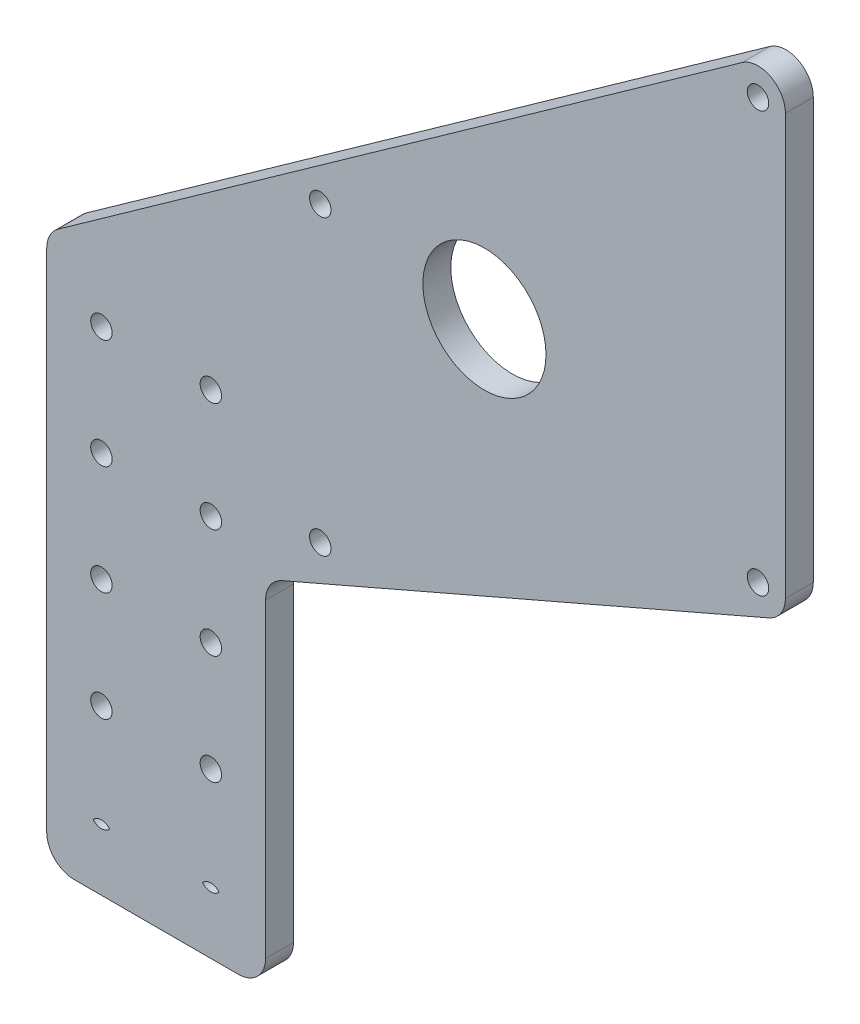
ISO-10303-21;
HEADER;
FILE_DESCRIPTION(('STEP AP214'),'2;1');
FILE_NAME('part.step','',(''),(''),'','','');
FILE_SCHEMA(('AUTOMOTIVE_DESIGN { 1 0 10303 214 1 1 1 1 }'));
ENDSEC;
DATA;
#1=APPLICATION_CONTEXT('core data for automotive mechanical design processes');
#2=APPLICATION_PROTOCOL_DEFINITION('international standard','automotive_design',2000,#1);
#3=PRODUCT_CONTEXT('',#1,'mechanical');
#4=PRODUCT('Part','Part','',(#3));
#5=PRODUCT_RELATED_PRODUCT_CATEGORY('part','',(#4));
#6=PRODUCT_DEFINITION_FORMATION('','',#4);
#7=PRODUCT_DEFINITION_CONTEXT('part definition',#1,'design');
#8=PRODUCT_DEFINITION('design','',#6,#7);
#9=PRODUCT_DEFINITION_SHAPE('','',#8);
#10=(LENGTH_UNIT() NAMED_UNIT(*) SI_UNIT(.MILLI.,.METRE.));
#11=(NAMED_UNIT(*) PLANE_ANGLE_UNIT() SI_UNIT($,.RADIAN.));
#12=(NAMED_UNIT(*) SI_UNIT($,.STERADIAN.) SOLID_ANGLE_UNIT());
#13=UNCERTAINTY_MEASURE_WITH_UNIT(LENGTH_MEASURE(1.E-05),#10,'distance_accuracy_value','');
#14=(GEOMETRIC_REPRESENTATION_CONTEXT(3) GLOBAL_UNCERTAINTY_ASSIGNED_CONTEXT((#13)) GLOBAL_UNIT_ASSIGNED_CONTEXT((#10,
#11,#12)) REPRESENTATION_CONTEXT('',''));
#15=CARTESIAN_POINT('',(0.,0.,0.));
#16=DIRECTION('',(0.,0.,1.));
#17=DIRECTION('',(1.,0.,0.));
#18=AXIS2_PLACEMENT_3D('',#15,#16,#17);
#19=CARTESIAN_POINT('',(482.6,0.,6.477));
#20=DIRECTION('',(1.,0.,0.));
#21=DIRECTION('',(0.,0.,-1.));
#22=AXIS2_PLACEMENT_3D('',#19,#20,#21);
#23=PLANE('',#22);
#24=DIRECTION('',(0.,-1.,0.));
#25=VECTOR('',#24,1.);
#26=CARTESIAN_POINT('',(482.6,0.,6.477));
#27=LINE('',#26,#25);
#28=CARTESIAN_POINT('',(482.6,573.049213564164,6.477));
#29=VERTEX_POINT('',#28);
#30=CARTESIAN_POINT('',(482.6,455.676,6.477));
#31=VERTEX_POINT('',#30);
#32=EDGE_CURVE('E219',#29,#31,#27,.T.);
#33=ORIENTED_EDGE('',*,*,#32,.F.);
#34=DIRECTION('',(0.,0.,-1.));
#35=VECTOR('',#34,1.);
#36=CARTESIAN_POINT('',(482.6,573.049213564164,0.));
#37=LINE('',#36,#35);
#38=CARTESIAN_POINT('',(482.6,573.049213564164,0.));
#39=VERTEX_POINT('',#38);
#40=EDGE_CURVE('E289',#29,#39,#37,.T.);
#41=ORIENTED_EDGE('',*,*,#40,.T.);
#42=DIRECTION('',(0.,-1.,0.));
#43=VECTOR('',#42,1.);
#44=CARTESIAN_POINT('',(482.6,0.,0.));
#45=LINE('',#44,#43);
#46=CARTESIAN_POINT('',(482.6,455.676,0.));
#47=VERTEX_POINT('',#46);
#48=EDGE_CURVE('E218',#39,#47,#45,.T.);
#49=ORIENTED_EDGE('',*,*,#48,.T.);
#50=DIRECTION('',(0.,0.,-1.));
#51=VECTOR('',#50,1.);
#52=CARTESIAN_POINT('',(482.6,455.676,6.477));
#53=LINE('',#52,#51);
#54=EDGE_CURVE('E287',#47,#31,#53,.F.);
#55=ORIENTED_EDGE('',*,*,#54,.T.);
#56=EDGE_LOOP('',(#33,#41,#49,#55));
#57=FACE_BOUND('',#56,.T.);
#58=ADVANCED_FACE('F43',(#57),#23,.F.);
#59=CARTESIAN_POINT('',(0.,449.326,6.477));
#60=DIRECTION('',(0.,1.,0.));
#61=DIRECTION('',(0.,0.,1.));
#62=AXIS2_PLACEMENT_3D('',#59,#60,#61);
#63=PLANE('',#62);
#64=DIRECTION('',(1.,0.,0.));
#65=VECTOR('',#64,1.);
#66=CARTESIAN_POINT('',(0.,449.326,6.477));
#67=LINE('',#66,#65);
#68=CARTESIAN_POINT('',(488.95,449.326,6.477));
#69=VERTEX_POINT('',#68);
#70=CARTESIAN_POINT('',(527.05,449.326,6.477));
#71=VERTEX_POINT('',#70);
#72=EDGE_CURVE('E222',#69,#71,#67,.T.);
#73=ORIENTED_EDGE('',*,*,#72,.F.);
#74=DIRECTION('',(0.,0.,-1.));
#75=VECTOR('',#74,1.);
#76=CARTESIAN_POINT('',(488.95,449.326,6.477));
#77=LINE('',#76,#75);
#78=CARTESIAN_POINT('',(488.95,449.326,0.));
#79=VERTEX_POINT('',#78);
#80=EDGE_CURVE('E298',#69,#79,#77,.T.);
#81=ORIENTED_EDGE('',*,*,#80,.T.);
#82=DIRECTION('',(1.,0.,0.));
#83=VECTOR('',#82,1.);
#84=CARTESIAN_POINT('',(0.,449.326,0.));
#85=LINE('',#84,#83);
#86=CARTESIAN_POINT('',(527.05,449.326,0.));
#87=VERTEX_POINT('',#86);
#88=EDGE_CURVE('E240',#79,#87,#85,.T.);
#89=ORIENTED_EDGE('',*,*,#88,.T.);
#90=DIRECTION('',(0.,0.,-1.));
#91=VECTOR('',#90,1.);
#92=CARTESIAN_POINT('',(527.05,449.326,6.477));
#93=LINE('',#92,#91);
#94=EDGE_CURVE('E296',#87,#71,#93,.F.);
#95=ORIENTED_EDGE('',*,*,#94,.T.);
#96=EDGE_LOOP('',(#73,#81,#89,#95));
#97=FACE_BOUND('',#96,.T.);
#98=ADVANCED_FACE('F344',(#97),#63,.F.);
#99=CARTESIAN_POINT('',(533.4,0.,6.477));
#100=DIRECTION('',(1.,0.,0.));
#101=DIRECTION('',(0.,0.,-1.));
#102=AXIS2_PLACEMENT_3D('',#99,#100,#101);
#103=PLANE('',#102);
#104=DIRECTION('',(0.,-1.,0.));
#105=VECTOR('',#104,1.);
#106=CARTESIAN_POINT('',(533.4,0.,0.));
#107=LINE('',#106,#105);
#108=CARTESIAN_POINT('',(533.4,527.708447184373,0.));
#109=VERTEX_POINT('',#108);
#110=CARTESIAN_POINT('',(533.4,455.676,0.));
#111=VERTEX_POINT('',#110);
#112=EDGE_CURVE('E243',#109,#111,#107,.T.);
#113=ORIENTED_EDGE('',*,*,#112,.F.);
#114=DIRECTION('',(0.,0.,-1.));
#115=VECTOR('',#114,1.);
#116=CARTESIAN_POINT('',(533.4,527.708447184373,6.477));
#117=LINE('',#116,#115);
#118=CARTESIAN_POINT('',(533.4,527.708447184373,6.477));
#119=VERTEX_POINT('',#118);
#120=EDGE_CURVE('E285',#109,#119,#117,.F.);
#121=ORIENTED_EDGE('',*,*,#120,.T.);
#122=DIRECTION('',(0.,-1.,0.));
#123=VECTOR('',#122,1.);
#124=CARTESIAN_POINT('',(533.4,0.,6.477));
#125=LINE('',#124,#123);
#126=CARTESIAN_POINT('',(533.4,455.676,6.477));
#127=VERTEX_POINT('',#126);
#128=EDGE_CURVE('E226',#119,#127,#125,.T.);
#129=ORIENTED_EDGE('',*,*,#128,.T.);
#130=DIRECTION('',(0.,0.,-1.));
#131=VECTOR('',#130,1.);
#132=CARTESIAN_POINT('',(533.4,455.676,0.));
#133=LINE('',#132,#131);
#134=EDGE_CURVE('E282',#127,#111,#133,.T.);
#135=ORIENTED_EDGE('',*,*,#134,.T.);
#136=EDGE_LOOP('',(#113,#121,#129,#135));
#137=FACE_BOUND('',#136,.T.);
#138=ADVANCED_FACE('F307',(#137),#103,.T.);
#139=CARTESIAN_POINT('',(-109.708999817194,252.969781131557,6.477));
#140=DIRECTION('',(-0.397878437417604,0.917438144529715,0.));
#141=DIRECTION('',(-0.917438144529715,-0.397878437417604,0.));
#142=AXIS2_PLACEMENT_3D('',#139,#140,#141);
#143=PLANE('',#142);
#144=DIRECTION('',(0.917438144529715,0.397878437417604,0.));
#145=VECTOR('',#144,1.);
#146=CARTESIAN_POINT('',(-109.708999817194,252.969781131557,0.));
#147=LINE('',#146,#145);
#148=CARTESIAN_POINT('',(537.223471922398,533.534179402137,0.));
#149=VERTEX_POINT('',#148);
#150=CARTESIAN_POINT('',(650.226528077602,582.54182059793,0.));
#151=VERTEX_POINT('',#150);
#152=EDGE_CURVE('E246',#149,#151,#147,.T.);
#153=ORIENTED_EDGE('',*,*,#152,.T.);
#154=DIRECTION('',(0.,0.,-1.));
#155=VECTOR('',#154,1.);
#156=CARTESIAN_POINT('',(650.226528077602,582.54182059793,6.477));
#157=LINE('',#156,#155);
#158=CARTESIAN_POINT('',(650.226528077602,582.54182059793,6.477));
#159=VERTEX_POINT('',#158);
#160=EDGE_CURVE('E271',#151,#159,#157,.F.);
#161=ORIENTED_EDGE('',*,*,#160,.T.);
#162=DIRECTION('',(0.917438144529715,0.397878437417604,0.));
#163=VECTOR('',#162,1.);
#164=CARTESIAN_POINT('',(-109.708999817194,252.969781131557,6.477));
#165=LINE('',#164,#163);
#166=CARTESIAN_POINT('',(537.223471922398,533.534179402137,6.477));
#167=VERTEX_POINT('',#166);
#168=EDGE_CURVE('E229',#167,#159,#165,.T.);
#169=ORIENTED_EDGE('',*,*,#168,.F.);
#170=DIRECTION('',(0.,0.,-1.));
#171=VECTOR('',#170,1.);
#172=CARTESIAN_POINT('',(537.223471922398,533.534179402137,6.477));
#173=LINE('',#172,#171);
#174=EDGE_CURVE('E268',#167,#149,#173,.T.);
#175=ORIENTED_EDGE('',*,*,#174,.T.);
#176=EDGE_LOOP('',(#153,#161,#169,#175));
#177=FACE_BOUND('',#176,.T.);
#178=ADVANCED_FACE('F316',(#177),#143,.F.);
#179=CARTESIAN_POINT('',(654.05,0.,6.477));
#180=DIRECTION('',(1.,0.,0.));
#181=DIRECTION('',(0.,0.,-1.));
#182=AXIS2_PLACEMENT_3D('',#179,#180,#181);
#183=PLANE('',#182);
#184=DIRECTION('',(0.,-1.,0.));
#185=VECTOR('',#184,1.);
#186=CARTESIAN_POINT('',(654.05,0.,6.477));
#187=LINE('',#186,#185);
#188=CARTESIAN_POINT('',(654.05,685.90815033516,6.477));
#189=VERTEX_POINT('',#188);
#190=CARTESIAN_POINT('',(654.05,588.367552815693,6.477));
#191=VERTEX_POINT('',#190);
#192=EDGE_CURVE('E232',#189,#191,#187,.T.);
#193=ORIENTED_EDGE('',*,*,#192,.T.);
#194=DIRECTION('',(0.,0.,-1.));
#195=VECTOR('',#194,1.);
#196=CARTESIAN_POINT('',(654.05,588.367552815693,0.));
#197=LINE('',#196,#195);
#198=CARTESIAN_POINT('',(654.05,588.367552815693,0.));
#199=VERTEX_POINT('',#198);
#200=EDGE_CURVE('E255',#191,#199,#197,.T.);
#201=ORIENTED_EDGE('',*,*,#200,.T.);
#202=DIRECTION('',(0.,-1.,0.));
#203=VECTOR('',#202,1.);
#204=CARTESIAN_POINT('',(654.05,0.,0.));
#205=LINE('',#204,#203);
#206=CARTESIAN_POINT('',(654.05,685.90815033516,0.));
#207=VERTEX_POINT('',#206);
#208=EDGE_CURVE('E249',#207,#199,#205,.T.);
#209=ORIENTED_EDGE('',*,*,#208,.F.);
#210=DIRECTION('',(0.,0.,-1.));
#211=VECTOR('',#210,1.);
#212=CARTESIAN_POINT('',(654.05,685.90815033516,6.477));
#213=LINE('',#212,#211);
#214=EDGE_CURVE('E237',#207,#189,#213,.F.);
#215=ORIENTED_EDGE('',*,*,#214,.T.);
#216=EDGE_LOOP('',(#193,#201,#209,#215));
#217=FACE_BOUND('',#216,.T.);
#218=ADVANCED_FACE('F322',(#217),#183,.T.);
#219=CARTESIAN_POINT('',(-110.143945438851,154.931030175283,6.477));
#220=DIRECTION('',(-0.579421651674522,0.815027944042883,0.));
#221=DIRECTION('',(-0.815027944042883,-0.579421651674522,0.));
#222=AXIS2_PLACEMENT_3D('',#219,#220,#221);
#223=PLANE('',#222);
#224=DIRECTION('',(0.815027944042883,0.579421651674522,0.));
#225=VECTOR('',#224,1.);
#226=CARTESIAN_POINT('',(-110.143945438851,154.931030175283,0.));
#227=LINE('',#226,#225);
#228=CARTESIAN_POINT('',(485.270672511867,578.224641008837,0.));
#229=VERTEX_POINT('',#228);
#230=CARTESIAN_POINT('',(644.020672511867,691.083577779833,0.));
#231=VERTEX_POINT('',#230);
#232=EDGE_CURVE('E223',#229,#231,#227,.T.);
#233=ORIENTED_EDGE('',*,*,#232,.F.);
#234=DIRECTION('',(0.,0.,-1.));
#235=VECTOR('',#234,1.);
#236=CARTESIAN_POINT('',(485.270672511867,578.224641008837,6.477));
#237=LINE('',#236,#235);
#238=CARTESIAN_POINT('',(485.270672511867,578.224641008837,6.477));
#239=VERTEX_POINT('',#238);
#240=EDGE_CURVE('E65',#229,#239,#237,.F.);
#241=ORIENTED_EDGE('',*,*,#240,.T.);
#242=DIRECTION('',(0.815027944042883,0.579421651674522,0.));
#243=VECTOR('',#242,1.);
#244=CARTESIAN_POINT('',(-110.143945438851,154.931030175283,6.477));
#245=LINE('',#244,#243);
#246=CARTESIAN_POINT('',(644.020672511867,691.083577779833,6.477));
#247=VERTEX_POINT('',#246);
#248=EDGE_CURVE('E235',#239,#247,#245,.T.);
#249=ORIENTED_EDGE('',*,*,#248,.T.);
#250=DIRECTION('',(0.,0.,-1.));
#251=VECTOR('',#250,1.);
#252=CARTESIAN_POINT('',(644.020672511867,691.083577779833,6.477));
#253=LINE('',#252,#251);
#254=EDGE_CURVE('E292',#247,#231,#253,.T.);
#255=ORIENTED_EDGE('',*,*,#254,.T.);
#256=EDGE_LOOP('',(#233,#241,#249,#255));
#257=FACE_BOUND('',#256,.T.);
#258=ADVANCED_FACE('F328',(#257),#223,.T.);
#259=CARTESIAN_POINT('',(0.,0.,6.477));
#260=DIRECTION('',(0.,0.,1.));
#261=DIRECTION('',(1.,0.,0.));
#262=AXIS2_PLACEMENT_3D('',#259,#260,#261);
#263=PLANE('',#262);
#264=CARTESIAN_POINT('',(546.1,545.637294927086,6.477));
#265=DIRECTION('',(0.,0.,1.));
#266=DIRECTION('',(1.,0.,0.));
#267=AXIS2_PLACEMENT_3D('',#264,#265,#266);
#268=CIRCLE('',#267,2.48919999999994);
#269=CARTESIAN_POINT('',(548.5892,545.637294927086,6.477));
#270=VERTEX_POINT('',#269);
#271=EDGE_CURVE('E612',#270,#270,#268,.T.);
#272=ORIENTED_EDGE('',*,*,#271,.F.);
#273=EDGE_LOOP('',(#272));
#274=FACE_BOUND('',#273,.T.);
#275=CARTESIAN_POINT('',(495.3,487.426,6.477));
#276=DIRECTION('',(0.,0.,1.));
#277=DIRECTION('',(1.,0.,0.));
#278=AXIS2_PLACEMENT_3D('',#275,#276,#277);
#279=CIRCLE('',#278,2.48920000000001);
#280=CARTESIAN_POINT('',(497.7892,487.426,6.477));
#281=VERTEX_POINT('',#280);
#282=EDGE_CURVE('E616',#281,#281,#279,.T.);
#283=ORIENTED_EDGE('',*,*,#282,.F.);
#284=EDGE_LOOP('',(#283));
#285=FACE_BOUND('',#284,.T.);
#286=CARTESIAN_POINT('',(520.7,487.426,6.477));
#287=DIRECTION('',(0.,0.,1.));
#288=DIRECTION('',(1.,0.,0.));
#289=AXIS2_PLACEMENT_3D('',#286,#287,#288);
#290=CIRCLE('',#289,2.48920000000006);
#291=CARTESIAN_POINT('',(523.1892,487.426,6.477));
#292=VERTEX_POINT('',#291);
#293=EDGE_CURVE('E620',#292,#292,#290,.T.);
#294=ORIENTED_EDGE('',*,*,#293,.F.);
#295=EDGE_LOOP('',(#294));
#296=FACE_BOUND('',#295,.T.);
#297=CARTESIAN_POINT('',(520.7,563.626,6.477));
#298=DIRECTION('',(0.,0.,1.));
#299=DIRECTION('',(1.,0.,0.));
#300=AXIS2_PLACEMENT_3D('',#297,#298,#299);
#301=CIRCLE('',#300,2.48920000000008);
#302=CARTESIAN_POINT('',(523.1892,563.626,6.477));
#303=VERTEX_POINT('',#302);
#304=EDGE_CURVE('E624',#303,#303,#301,.T.);
#305=ORIENTED_EDGE('',*,*,#304,.F.);
#306=EDGE_LOOP('',(#305));
#307=FACE_BOUND('',#306,.T.);
#308=CARTESIAN_POINT('',(647.7,588.416242295507,6.477));
#309=DIRECTION('',(0.,0.,1.));
#310=DIRECTION('',(1.,0.,0.));
#311=AXIS2_PLACEMENT_3D('',#308,#309,#310);
#312=CIRCLE('',#311,2.48919999999994);
#313=CARTESIAN_POINT('',(650.1892,588.416242295507,6.477));
#314=VERTEX_POINT('',#313);
#315=EDGE_CURVE('E201',#314,#314,#312,.T.);
#316=ORIENTED_EDGE('',*,*,#315,.F.);
#317=EDGE_LOOP('',(#316));
#318=FACE_BOUND('',#317,.T.);
#319=CARTESIAN_POINT('',(647.7,685.90815033516,6.477));
#320=DIRECTION('',(0.,0.,1.));
#321=DIRECTION('',(1.,0.,0.));
#322=AXIS2_PLACEMENT_3D('',#319,#320,#321);
#323=CIRCLE('',#322,2.48919999999994);
#324=CARTESIAN_POINT('',(650.1892,685.90815033516,6.477));
#325=VERTEX_POINT('',#324);
#326=EDGE_CURVE('E195',#325,#325,#323,.T.);
#327=ORIENTED_EDGE('',*,*,#326,.F.);
#328=EDGE_LOOP('',(#327));
#329=FACE_BOUND('',#328,.T.);
#330=CARTESIAN_POINT('',(584.20000000001,609.600000000067,6.477));
#331=DIRECTION('',(0.,0.,1.));
#332=DIRECTION('',(1.,0.,0.));
#333=AXIS2_PLACEMENT_3D('',#330,#331,#332);
#334=CIRCLE('',#333,14.2875000000112);
#335=CARTESIAN_POINT('',(598.487500000021,609.600000000067,6.477));
#336=VERTEX_POINT('',#335);
#337=EDGE_CURVE('E189',#336,#336,#334,.T.);
#338=ORIENTED_EDGE('',*,*,#337,.F.);
#339=EDGE_LOOP('',(#338));
#340=FACE_BOUND('',#339,.T.);
#341=CARTESIAN_POINT('',(520.7,462.026,6.477));
#342=DIRECTION('',(0.,0.,1.));
#343=DIRECTION('',(1.,0.,0.));
#344=AXIS2_PLACEMENT_3D('',#341,#342,#343);
#345=CIRCLE('',#344,2.48920000000006);
#346=CARTESIAN_POINT('',(522.61727942408,463.6135,6.477));
#347=VERTEX_POINT('',#346);
#348=CARTESIAN_POINT('',(518.78272057592,463.6135,6.477));
#349=VERTEX_POINT('',#348);
#350=EDGE_CURVE('E184',#347,#349,#345,.T.);
#351=ORIENTED_EDGE('',*,*,#350,.F.);
#352=CARTESIAN_POINT('',(520.7,465.201,6.477));
#353=DIRECTION('',(0.,0.,1.));
#354=DIRECTION('',(1.,0.,0.));
#355=AXIS2_PLACEMENT_3D('',#352,#353,#354);
#356=CIRCLE('',#355,2.48919999999995);
#357=EDGE_CURVE('E167',#349,#347,#356,.T.);
#358=ORIENTED_EDGE('',*,*,#357,.F.);
#359=EDGE_LOOP('',(#351,#358));
#360=FACE_BOUND('',#359,.T.);
#361=CARTESIAN_POINT('',(546.1,613.678430801723,6.477));
#362=DIRECTION('',(0.,0.,1.));
#363=DIRECTION('',(1.,0.,0.));
#364=AXIS2_PLACEMENT_3D('',#361,#362,#363);
#365=CIRCLE('',#364,2.48919999999994);
#366=CARTESIAN_POINT('',(548.5892,613.678430801723,6.477));
#367=VERTEX_POINT('',#366);
#368=EDGE_CURVE('E635',#367,#367,#365,.T.);
#369=ORIENTED_EDGE('',*,*,#368,.F.);
#370=EDGE_LOOP('',(#369));
#371=FACE_BOUND('',#370,.T.);
#372=CARTESIAN_POINT('',(520.7,512.826,6.477));
#373=DIRECTION('',(0.,0.,1.));
#374=DIRECTION('',(1.,0.,0.));
#375=AXIS2_PLACEMENT_3D('',#372,#373,#374);
#376=CIRCLE('',#375,2.48919999999994);
#377=CARTESIAN_POINT('',(523.1892,512.826,6.477));
#378=VERTEX_POINT('',#377);
#379=EDGE_CURVE('E639',#378,#378,#376,.T.);
#380=ORIENTED_EDGE('',*,*,#379,.F.);
#381=EDGE_LOOP('',(#380));
#382=FACE_BOUND('',#381,.T.);
#383=CARTESIAN_POINT('',(495.3,563.626,6.477));
#384=DIRECTION('',(0.,0.,1.));
#385=DIRECTION('',(1.,0.,0.));
#386=AXIS2_PLACEMENT_3D('',#383,#384,#385);
#387=CIRCLE('',#386,2.48919999999988);
#388=CARTESIAN_POINT('',(497.7892,563.626,6.477));
#389=VERTEX_POINT('',#388);
#390=EDGE_CURVE('E643',#389,#389,#387,.T.);
#391=ORIENTED_EDGE('',*,*,#390,.F.);
#392=EDGE_LOOP('',(#391));
#393=FACE_BOUND('',#392,.T.);
#394=CARTESIAN_POINT('',(495.3,538.226,6.477));
#395=DIRECTION('',(0.,0.,1.));
#396=DIRECTION('',(1.,0.,0.));
#397=AXIS2_PLACEMENT_3D('',#394,#395,#396);
#398=CIRCLE('',#397,2.48919999999988);
#399=CARTESIAN_POINT('',(497.7892,538.226,6.477));
#400=VERTEX_POINT('',#399);
#401=EDGE_CURVE('E647',#400,#400,#398,.T.);
#402=ORIENTED_EDGE('',*,*,#401,.F.);
#403=EDGE_LOOP('',(#402));
#404=FACE_BOUND('',#403,.T.);
#405=CARTESIAN_POINT('',(520.7,538.226,6.477));
#406=DIRECTION('',(0.,0.,1.));
#407=DIRECTION('',(1.,0.,0.));
#408=AXIS2_PLACEMENT_3D('',#405,#406,#407);
#409=CIRCLE('',#408,2.48919999999994);
#410=CARTESIAN_POINT('',(523.1892,538.226,6.477));
#411=VERTEX_POINT('',#410);
#412=EDGE_CURVE('E651',#411,#411,#409,.T.);
#413=ORIENTED_EDGE('',*,*,#412,.F.);
#414=EDGE_LOOP('',(#413));
#415=FACE_BOUND('',#414,.T.);
#416=CARTESIAN_POINT('',(495.3,512.826,6.477));
#417=DIRECTION('',(0.,0.,1.));
#418=DIRECTION('',(1.,0.,0.));
#419=AXIS2_PLACEMENT_3D('',#416,#417,#418);
#420=CIRCLE('',#419,2.48919999999994);
#421=CARTESIAN_POINT('',(497.7892,512.826,6.477));
#422=VERTEX_POINT('',#421);
#423=EDGE_CURVE('E655',#422,#422,#420,.T.);
#424=ORIENTED_EDGE('',*,*,#423,.F.);
#425=EDGE_LOOP('',(#424));
#426=FACE_BOUND('',#425,.T.);
#427=CARTESIAN_POINT('',(495.3,462.026,6.477));
#428=DIRECTION('',(0.,0.,1.));
#429=DIRECTION('',(1.,0.,0.));
#430=AXIS2_PLACEMENT_3D('',#427,#428,#429);
#431=CIRCLE('',#430,2.48919999999995);
#432=CARTESIAN_POINT('',(497.21727942408,463.6135,6.477));
#433=VERTEX_POINT('',#432);
#434=CARTESIAN_POINT('',(493.38272057592,463.6135,6.477));
#435=VERTEX_POINT('',#434);
#436=EDGE_CURVE('E208',#433,#435,#431,.T.);
#437=ORIENTED_EDGE('',*,*,#436,.F.);
#438=CARTESIAN_POINT('',(495.3,465.201,6.477));
#439=DIRECTION('',(0.,0.,1.));
#440=DIRECTION('',(1.,0.,0.));
#441=AXIS2_PLACEMENT_3D('',#438,#439,#440);
#442=CIRCLE('',#441,2.48920000000001);
#443=EDGE_CURVE('E205',#435,#433,#442,.T.);
#444=ORIENTED_EDGE('',*,*,#443,.F.);
#445=EDGE_LOOP('',(#437,#444));
#446=FACE_BOUND('',#445,.T.);
#447=ORIENTED_EDGE('',*,*,#168,.T.);
#448=CARTESIAN_POINT('',(647.7,588.367552815693,6.477));
#449=DIRECTION('',(0.,0.,1.));
#450=DIRECTION('',(1.,0.,0.));
#451=AXIS2_PLACEMENT_3D('',#448,#449,#450);
#452=CIRCLE('',#451,6.35);
#453=EDGE_CURVE('E280',#159,#191,#452,.T.);
#454=ORIENTED_EDGE('',*,*,#453,.T.);
#455=ORIENTED_EDGE('',*,*,#192,.F.);
#456=CARTESIAN_POINT('',(647.7,685.90815033516,6.477));
#457=DIRECTION('',(0.,0.,1.));
#458=DIRECTION('',(1.,0.,0.));
#459=AXIS2_PLACEMENT_3D('',#456,#457,#458);
#460=CIRCLE('',#459,6.35);
#461=EDGE_CURVE('E58',#189,#247,#460,.T.);
#462=ORIENTED_EDGE('',*,*,#461,.T.);
#463=ORIENTED_EDGE('',*,*,#248,.F.);
#464=CARTESIAN_POINT('',(488.95,573.049213564164,6.477));
#465=DIRECTION('',(0.,0.,1.));
#466=DIRECTION('',(1.,0.,0.));
#467=AXIS2_PLACEMENT_3D('',#464,#465,#466);
#468=CIRCLE('',#467,6.35);
#469=EDGE_CURVE('E278',#239,#29,#468,.T.);
#470=ORIENTED_EDGE('',*,*,#469,.T.);
#471=ORIENTED_EDGE('',*,*,#32,.T.);
#472=CARTESIAN_POINT('',(488.95,455.676,6.477));
#473=DIRECTION('',(0.,0.,1.));
#474=DIRECTION('',(1.,0.,0.));
#475=AXIS2_PLACEMENT_3D('',#472,#473,#474);
#476=CIRCLE('',#475,6.35);
#477=EDGE_CURVE('E275',#31,#69,#476,.T.);
#478=ORIENTED_EDGE('',*,*,#477,.T.);
#479=ORIENTED_EDGE('',*,*,#72,.T.);
#480=CARTESIAN_POINT('',(527.05,455.676,6.477));
#481=DIRECTION('',(0.,0.,1.));
#482=DIRECTION('',(1.,0.,0.));
#483=AXIS2_PLACEMENT_3D('',#480,#481,#482);
#484=CIRCLE('',#483,6.35);
#485=EDGE_CURVE('E273',#71,#127,#484,.T.);
#486=ORIENTED_EDGE('',*,*,#485,.T.);
#487=ORIENTED_EDGE('',*,*,#128,.F.);
#488=CARTESIAN_POINT('',(539.75,527.708447184373,6.477));
#489=DIRECTION('',(0.,0.,1.));
#490=DIRECTION('',(1.,0.,0.));
#491=AXIS2_PLACEMENT_3D('',#488,#489,#490);
#492=CIRCLE('',#491,6.35);
#493=EDGE_CURVE('E11',#119,#167,#492,.F.);
#494=ORIENTED_EDGE('',*,*,#493,.T.);
#495=EDGE_LOOP('',(#447,#454,#455,#462,#463,#470,#471,#478,#479,#486,#487,#494));
#496=FACE_BOUND('',#495,.T.);
#497=ADVANCED_FACE('F313',(#274,#285,#296,#307,#318,#329,#340,#360,#371,#382,#393,#404,#415,
#426,#446,#496),#263,.T.);
#498=CARTESIAN_POINT('',(0.,0.,0.));
#499=DIRECTION('',(0.,0.,1.));
#500=DIRECTION('',(1.,0.,0.));
#501=AXIS2_PLACEMENT_3D('',#498,#499,#500);
#502=PLANE('',#501);
#503=CARTESIAN_POINT('',(546.1,545.637294927086,0.));
#504=DIRECTION('',(0.,0.,1.));
#505=DIRECTION('',(1.,0.,0.));
#506=AXIS2_PLACEMENT_3D('',#503,#504,#505);
#507=CIRCLE('',#506,2.48919999999994);
#508=CARTESIAN_POINT('',(548.5892,545.637294927086,0.));
#509=VERTEX_POINT('',#508);
#510=EDGE_CURVE('E204',#509,#509,#507,.T.);
#511=ORIENTED_EDGE('',*,*,#510,.T.);
#512=EDGE_LOOP('',(#511));
#513=FACE_BOUND('',#512,.T.);
#514=CARTESIAN_POINT('',(495.3,487.426,0.));
#515=DIRECTION('',(0.,0.,1.));
#516=DIRECTION('',(1.,0.,0.));
#517=AXIS2_PLACEMENT_3D('',#514,#515,#516);
#518=CIRCLE('',#517,2.48920000000001);
#519=CARTESIAN_POINT('',(497.7892,487.426,0.));
#520=VERTEX_POINT('',#519);
#521=EDGE_CURVE('E689',#520,#520,#518,.T.);
#522=ORIENTED_EDGE('',*,*,#521,.T.);
#523=EDGE_LOOP('',(#522));
#524=FACE_BOUND('',#523,.T.);
#525=CARTESIAN_POINT('',(520.7,487.426,0.));
#526=DIRECTION('',(0.,0.,1.));
#527=DIRECTION('',(1.,0.,0.));
#528=AXIS2_PLACEMENT_3D('',#525,#526,#527);
#529=CIRCLE('',#528,2.48920000000006);
#530=CARTESIAN_POINT('',(523.1892,487.426,0.));
#531=VERTEX_POINT('',#530);
#532=EDGE_CURVE('E678',#531,#531,#529,.T.);
#533=ORIENTED_EDGE('',*,*,#532,.T.);
#534=EDGE_LOOP('',(#533));
#535=FACE_BOUND('',#534,.T.);
#536=CARTESIAN_POINT('',(520.7,563.626,0.));
#537=DIRECTION('',(0.,0.,1.));
#538=DIRECTION('',(1.,0.,0.));
#539=AXIS2_PLACEMENT_3D('',#536,#537,#538);
#540=CIRCLE('',#539,2.48920000000008);
#541=CARTESIAN_POINT('',(523.1892,563.626,0.));
#542=VERTEX_POINT('',#541);
#543=EDGE_CURVE('E682',#542,#542,#540,.T.);
#544=ORIENTED_EDGE('',*,*,#543,.T.);
#545=EDGE_LOOP('',(#544));
#546=FACE_BOUND('',#545,.T.);
#547=CARTESIAN_POINT('',(647.7,588.416242295507,0.));
#548=DIRECTION('',(0.,0.,1.));
#549=DIRECTION('',(1.,0.,0.));
#550=AXIS2_PLACEMENT_3D('',#547,#548,#549);
#551=CIRCLE('',#550,2.48919999999994);
#552=CARTESIAN_POINT('',(650.1892,588.416242295507,0.));
#553=VERTEX_POINT('',#552);
#554=EDGE_CURVE('E198',#553,#553,#551,.T.);
#555=ORIENTED_EDGE('',*,*,#554,.T.);
#556=EDGE_LOOP('',(#555));
#557=FACE_BOUND('',#556,.T.);
#558=CARTESIAN_POINT('',(647.7,685.90815033516,0.));
#559=DIRECTION('',(0.,0.,1.));
#560=DIRECTION('',(1.,0.,0.));
#561=AXIS2_PLACEMENT_3D('',#558,#559,#560);
#562=CIRCLE('',#561,2.48919999999994);
#563=CARTESIAN_POINT('',(650.1892,685.90815033516,0.));
#564=VERTEX_POINT('',#563);
#565=EDGE_CURVE('E192',#564,#564,#562,.T.);
#566=ORIENTED_EDGE('',*,*,#565,.T.);
#567=EDGE_LOOP('',(#566));
#568=FACE_BOUND('',#567,.T.);
#569=CARTESIAN_POINT('',(584.20000000001,609.600000000067,0.));
#570=DIRECTION('',(0.,0.,1.));
#571=DIRECTION('',(1.,0.,0.));
#572=AXIS2_PLACEMENT_3D('',#569,#570,#571);
#573=CIRCLE('',#572,14.2875000000112);
#574=CARTESIAN_POINT('',(598.487500000021,609.600000000067,0.));
#575=VERTEX_POINT('',#574);
#576=EDGE_CURVE('E173',#575,#575,#573,.T.);
#577=ORIENTED_EDGE('',*,*,#576,.T.);
#578=EDGE_LOOP('',(#577));
#579=FACE_BOUND('',#578,.T.);
#580=CARTESIAN_POINT('',(520.7,465.201,0.));
#581=DIRECTION('',(0.,0.,1.));
#582=DIRECTION('',(1.,0.,0.));
#583=AXIS2_PLACEMENT_3D('',#580,#581,#582);
#584=CIRCLE('',#583,2.48919999999995);
#585=CARTESIAN_POINT('',(518.78272057592,463.6135,0.));
#586=VERTEX_POINT('',#585);
#587=CARTESIAN_POINT('',(522.61727942408,463.6135,0.));
#588=VERTEX_POINT('',#587);
#589=EDGE_CURVE('E166',#586,#588,#584,.T.);
#590=ORIENTED_EDGE('',*,*,#589,.T.);
#591=CARTESIAN_POINT('',(520.7,462.026,0.));
#592=DIRECTION('',(0.,0.,1.));
#593=DIRECTION('',(1.,0.,0.));
#594=AXIS2_PLACEMENT_3D('',#591,#592,#593);
#595=CIRCLE('',#594,2.48920000000006);
#596=EDGE_CURVE('E157',#588,#586,#595,.T.);
#597=ORIENTED_EDGE('',*,*,#596,.T.);
#598=EDGE_LOOP('',(#590,#597));
#599=FACE_BOUND('',#598,.T.);
#600=CARTESIAN_POINT('',(546.1,613.678430801723,0.));
#601=DIRECTION('',(0.,0.,1.));
#602=DIRECTION('',(1.,0.,0.));
#603=AXIS2_PLACEMENT_3D('',#600,#601,#602);
#604=CIRCLE('',#603,2.48919999999994);
#605=CARTESIAN_POINT('',(548.5892,613.678430801723,0.));
#606=VERTEX_POINT('',#605);
#607=EDGE_CURVE('E718',#606,#606,#604,.T.);
#608=ORIENTED_EDGE('',*,*,#607,.T.);
#609=EDGE_LOOP('',(#608));
#610=FACE_BOUND('',#609,.T.);
#611=CARTESIAN_POINT('',(520.7,512.826,0.));
#612=DIRECTION('',(0.,0.,1.));
#613=DIRECTION('',(1.,0.,0.));
#614=AXIS2_PLACEMENT_3D('',#611,#612,#613);
#615=CIRCLE('',#614,2.48919999999994);
#616=CARTESIAN_POINT('',(523.1892,512.826,0.));
#617=VERTEX_POINT('',#616);
#618=EDGE_CURVE('E661',#617,#617,#615,.T.);
#619=ORIENTED_EDGE('',*,*,#618,.T.);
#620=EDGE_LOOP('',(#619));
#621=FACE_BOUND('',#620,.T.);
#622=CARTESIAN_POINT('',(495.3,563.626,0.));
#623=DIRECTION('',(0.,0.,1.));
#624=DIRECTION('',(1.,0.,0.));
#625=AXIS2_PLACEMENT_3D('',#622,#623,#624);
#626=CIRCLE('',#625,2.48919999999988);
#627=CARTESIAN_POINT('',(497.7892,563.626,0.));
#628=VERTEX_POINT('',#627);
#629=EDGE_CURVE('E669',#628,#628,#626,.T.);
#630=ORIENTED_EDGE('',*,*,#629,.T.);
#631=EDGE_LOOP('',(#630));
#632=FACE_BOUND('',#631,.T.);
#633=CARTESIAN_POINT('',(495.3,538.226,0.));
#634=DIRECTION('',(0.,0.,1.));
#635=DIRECTION('',(1.,0.,0.));
#636=AXIS2_PLACEMENT_3D('',#633,#634,#635);
#637=CIRCLE('',#636,2.48919999999988);
#638=CARTESIAN_POINT('',(497.7892,538.226,0.));
#639=VERTEX_POINT('',#638);
#640=EDGE_CURVE('E673',#639,#639,#637,.T.);
#641=ORIENTED_EDGE('',*,*,#640,.T.);
#642=EDGE_LOOP('',(#641));
#643=FACE_BOUND('',#642,.T.);
#644=CARTESIAN_POINT('',(520.7,538.226,0.));
#645=DIRECTION('',(0.,0.,1.));
#646=DIRECTION('',(1.,0.,0.));
#647=AXIS2_PLACEMENT_3D('',#644,#645,#646);
#648=CIRCLE('',#647,2.48919999999994);
#649=CARTESIAN_POINT('',(523.1892,538.226,0.));
#650=VERTEX_POINT('',#649);
#651=EDGE_CURVE('E677',#650,#650,#648,.T.);
#652=ORIENTED_EDGE('',*,*,#651,.T.);
#653=EDGE_LOOP('',(#652));
#654=FACE_BOUND('',#653,.T.);
#655=CARTESIAN_POINT('',(495.3,512.826,0.));
#656=DIRECTION('',(0.,0.,1.));
#657=DIRECTION('',(1.,0.,0.));
#658=AXIS2_PLACEMENT_3D('',#655,#656,#657);
#659=CIRCLE('',#658,2.48919999999994);
#660=CARTESIAN_POINT('',(497.7892,512.826,0.));
#661=VERTEX_POINT('',#660);
#662=EDGE_CURVE('E660',#661,#661,#659,.T.);
#663=ORIENTED_EDGE('',*,*,#662,.T.);
#664=EDGE_LOOP('',(#663));
#665=FACE_BOUND('',#664,.T.);
#666=CARTESIAN_POINT('',(495.3,465.201,0.));
#667=DIRECTION('',(0.,0.,1.));
#668=DIRECTION('',(1.,0.,0.));
#669=AXIS2_PLACEMENT_3D('',#666,#667,#668);
#670=CIRCLE('',#669,2.48920000000001);
#671=CARTESIAN_POINT('',(493.38272057592,463.6135,0.));
#672=VERTEX_POINT('',#671);
#673=CARTESIAN_POINT('',(497.21727942408,463.6135,0.));
#674=VERTEX_POINT('',#673);
#675=EDGE_CURVE('E177',#672,#674,#670,.T.);
#676=ORIENTED_EDGE('',*,*,#675,.T.);
#677=CARTESIAN_POINT('',(495.3,462.026,0.));
#678=DIRECTION('',(0.,0.,1.));
#679=DIRECTION('',(1.,0.,0.));
#680=AXIS2_PLACEMENT_3D('',#677,#678,#679);
#681=CIRCLE('',#680,2.48919999999995);
#682=EDGE_CURVE('E180',#674,#672,#681,.T.);
#683=ORIENTED_EDGE('',*,*,#682,.T.);
#684=EDGE_LOOP('',(#676,#683));
#685=FACE_BOUND('',#684,.T.);
#686=ORIENTED_EDGE('',*,*,#208,.T.);
#687=CARTESIAN_POINT('',(647.7,588.367552815693,0.));
#688=DIRECTION('',(0.,0.,1.));
#689=DIRECTION('',(1.,0.,0.));
#690=AXIS2_PLACEMENT_3D('',#687,#688,#689);
#691=CIRCLE('',#690,6.35);
#692=EDGE_CURVE('E266',#199,#151,#691,.F.);
#693=ORIENTED_EDGE('',*,*,#692,.T.);
#694=ORIENTED_EDGE('',*,*,#152,.F.);
#695=CARTESIAN_POINT('',(539.75,527.708447184373,0.));
#696=DIRECTION('',(0.,0.,1.));
#697=DIRECTION('',(1.,0.,0.));
#698=AXIS2_PLACEMENT_3D('',#695,#696,#697);
#699=CIRCLE('',#698,6.35);
#700=EDGE_CURVE('E51',#149,#109,#699,.T.);
#701=ORIENTED_EDGE('',*,*,#700,.T.);
#702=ORIENTED_EDGE('',*,*,#112,.T.);
#703=CARTESIAN_POINT('',(527.05,455.676,0.));
#704=DIRECTION('',(0.,0.,1.));
#705=DIRECTION('',(1.,0.,0.));
#706=AXIS2_PLACEMENT_3D('',#703,#704,#705);
#707=CIRCLE('',#706,6.35);
#708=EDGE_CURVE('E258',#111,#87,#707,.F.);
#709=ORIENTED_EDGE('',*,*,#708,.T.);
#710=ORIENTED_EDGE('',*,*,#88,.F.);
#711=CARTESIAN_POINT('',(488.95,455.676,0.));
#712=DIRECTION('',(0.,0.,1.));
#713=DIRECTION('',(1.,0.,0.));
#714=AXIS2_PLACEMENT_3D('',#711,#712,#713);
#715=CIRCLE('',#714,6.35);
#716=EDGE_CURVE('E260',#79,#47,#715,.F.);
#717=ORIENTED_EDGE('',*,*,#716,.T.);
#718=ORIENTED_EDGE('',*,*,#48,.F.);
#719=CARTESIAN_POINT('',(488.95,573.049213564164,0.));
#720=DIRECTION('',(0.,0.,1.));
#721=DIRECTION('',(1.,0.,0.));
#722=AXIS2_PLACEMENT_3D('',#719,#720,#721);
#723=CIRCLE('',#722,6.35);
#724=EDGE_CURVE('E264',#39,#229,#723,.F.);
#725=ORIENTED_EDGE('',*,*,#724,.T.);
#726=ORIENTED_EDGE('',*,*,#232,.T.);
#727=CARTESIAN_POINT('',(647.7,685.90815033516,0.));
#728=DIRECTION('',(0.,0.,1.));
#729=DIRECTION('',(1.,0.,0.));
#730=AXIS2_PLACEMENT_3D('',#727,#728,#729);
#731=CIRCLE('',#730,6.35);
#732=EDGE_CURVE('E262',#231,#207,#731,.F.);
#733=ORIENTED_EDGE('',*,*,#732,.T.);
#734=EDGE_LOOP('',(#686,#693,#694,#701,#702,#709,#710,#717,#718,#725,#726,#733));
#735=FACE_BOUND('',#734,.T.);
#736=ADVANCED_FACE('F175',(#513,#524,#535,#546,#557,#568,#579,#599,#610,#621,#632,#643,#654,
#665,#685,#735),#502,.F.);
#737=CARTESIAN_POINT('',(495.3,465.201,6.477));
#738=DIRECTION('',(0.,0.,-1.));
#739=DIRECTION('',(-1.,0.,0.));
#740=AXIS2_PLACEMENT_3D('',#737,#738,#739);
#741=CYLINDRICAL_SURFACE('',#740,2.48920000000001);
#742=ORIENTED_EDGE('',*,*,#675,.F.);
#743=DIRECTION('',(0.,0.,-1.));
#744=VECTOR('',#743,1.);
#745=CARTESIAN_POINT('',(493.38272057592,463.6135,6.477));
#746=LINE('',#745,#744);
#747=EDGE_CURVE('E209',#435,#672,#746,.T.);
#748=ORIENTED_EDGE('',*,*,#747,.F.);
#749=ORIENTED_EDGE('',*,*,#443,.T.);
#750=DIRECTION('',(0.,0.,-1.));
#751=VECTOR('',#750,1.);
#752=CARTESIAN_POINT('',(497.21727942408,463.6135,6.477));
#753=LINE('',#752,#751);
#754=EDGE_CURVE('E215',#433,#674,#753,.T.);
#755=ORIENTED_EDGE('',*,*,#754,.T.);
#756=EDGE_LOOP('',(#742,#748,#749,#755));
#757=FACE_BOUND('',#756,.T.);
#758=ADVANCED_FACE('F536',(#757),#741,.F.);
#759=CARTESIAN_POINT('',(495.3,462.026,6.477));
#760=DIRECTION('',(0.,0.,-1.));
#761=DIRECTION('',(-1.,0.,0.));
#762=AXIS2_PLACEMENT_3D('',#759,#760,#761);
#763=CYLINDRICAL_SURFACE('',#762,2.48919999999995);
#764=ORIENTED_EDGE('',*,*,#682,.F.);
#765=ORIENTED_EDGE('',*,*,#754,.F.);
#766=ORIENTED_EDGE('',*,*,#436,.T.);
#767=ORIENTED_EDGE('',*,*,#747,.T.);
#768=EDGE_LOOP('',(#764,#765,#766,#767));
#769=FACE_BOUND('',#768,.T.);
#770=ADVANCED_FACE('F527',(#769),#763,.F.);
#771=CARTESIAN_POINT('',(495.3,512.826,6.477));
#772=DIRECTION('',(0.,0.,-1.));
#773=DIRECTION('',(-1.,0.,0.));
#774=AXIS2_PLACEMENT_3D('',#771,#772,#773);
#775=CYLINDRICAL_SURFACE('',#774,2.48919999999994);
#776=ORIENTED_EDGE('',*,*,#423,.T.);
#777=EDGE_LOOP('',(#776));
#778=FACE_BOUND('',#777,.T.);
#779=ORIENTED_EDGE('',*,*,#662,.F.);
#780=EDGE_LOOP('',(#779));
#781=FACE_BOUND('',#780,.T.);
#782=ADVANCED_FACE('F518',(#778,#781),#775,.F.);
#783=CARTESIAN_POINT('',(520.7,538.226,6.477));
#784=DIRECTION('',(0.,0.,-1.));
#785=DIRECTION('',(-1.,0.,0.));
#786=AXIS2_PLACEMENT_3D('',#783,#784,#785);
#787=CYLINDRICAL_SURFACE('',#786,2.48919999999994);
#788=ORIENTED_EDGE('',*,*,#412,.T.);
#789=EDGE_LOOP('',(#788));
#790=FACE_BOUND('',#789,.T.);
#791=ORIENTED_EDGE('',*,*,#651,.F.);
#792=EDGE_LOOP('',(#791));
#793=FACE_BOUND('',#792,.T.);
#794=ADVANCED_FACE('F509',(#790,#793),#787,.F.);
#795=CARTESIAN_POINT('',(495.3,538.226,6.477));
#796=DIRECTION('',(0.,0.,-1.));
#797=DIRECTION('',(-1.,0.,0.));
#798=AXIS2_PLACEMENT_3D('',#795,#796,#797);
#799=CYLINDRICAL_SURFACE('',#798,2.48919999999988);
#800=ORIENTED_EDGE('',*,*,#401,.T.);
#801=EDGE_LOOP('',(#800));
#802=FACE_BOUND('',#801,.T.);
#803=ORIENTED_EDGE('',*,*,#640,.F.);
#804=EDGE_LOOP('',(#803));
#805=FACE_BOUND('',#804,.T.);
#806=ADVANCED_FACE('F500',(#802,#805),#799,.F.);
#807=CARTESIAN_POINT('',(495.3,563.626,6.477));
#808=DIRECTION('',(0.,0.,-1.));
#809=DIRECTION('',(-1.,0.,0.));
#810=AXIS2_PLACEMENT_3D('',#807,#808,#809);
#811=CYLINDRICAL_SURFACE('',#810,2.48919999999988);
#812=ORIENTED_EDGE('',*,*,#390,.T.);
#813=EDGE_LOOP('',(#812));
#814=FACE_BOUND('',#813,.T.);
#815=ORIENTED_EDGE('',*,*,#629,.F.);
#816=EDGE_LOOP('',(#815));
#817=FACE_BOUND('',#816,.T.);
#818=ADVANCED_FACE('F491',(#814,#817),#811,.F.);
#819=CARTESIAN_POINT('',(520.7,512.826,6.477));
#820=DIRECTION('',(0.,0.,-1.));
#821=DIRECTION('',(-1.,0.,0.));
#822=AXIS2_PLACEMENT_3D('',#819,#820,#821);
#823=CYLINDRICAL_SURFACE('',#822,2.48919999999994);
#824=ORIENTED_EDGE('',*,*,#379,.T.);
#825=EDGE_LOOP('',(#824));
#826=FACE_BOUND('',#825,.T.);
#827=ORIENTED_EDGE('',*,*,#618,.F.);
#828=EDGE_LOOP('',(#827));
#829=FACE_BOUND('',#828,.T.);
#830=ADVANCED_FACE('F482',(#826,#829),#823,.F.);
#831=CARTESIAN_POINT('',(546.1,613.678430801723,6.477));
#832=DIRECTION('',(0.,0.,-1.));
#833=DIRECTION('',(-1.,0.,0.));
#834=AXIS2_PLACEMENT_3D('',#831,#832,#833);
#835=CYLINDRICAL_SURFACE('',#834,2.48919999999994);
#836=ORIENTED_EDGE('',*,*,#368,.T.);
#837=EDGE_LOOP('',(#836));
#838=FACE_BOUND('',#837,.T.);
#839=ORIENTED_EDGE('',*,*,#607,.F.);
#840=EDGE_LOOP('',(#839));
#841=FACE_BOUND('',#840,.T.);
#842=ADVANCED_FACE('F474',(#838,#841),#835,.F.);
#843=CARTESIAN_POINT('',(520.7,465.201,6.477));
#844=DIRECTION('',(0.,0.,-1.));
#845=DIRECTION('',(-1.,0.,0.));
#846=AXIS2_PLACEMENT_3D('',#843,#844,#845);
#847=CYLINDRICAL_SURFACE('',#846,2.48919999999995);
#848=ORIENTED_EDGE('',*,*,#589,.F.);
#849=DIRECTION('',(0.,0.,-1.));
#850=VECTOR('',#849,1.);
#851=CARTESIAN_POINT('',(518.78272057592,463.6135,6.477));
#852=LINE('',#851,#850);
#853=EDGE_CURVE('E163',#349,#586,#852,.T.);
#854=ORIENTED_EDGE('',*,*,#853,.F.);
#855=ORIENTED_EDGE('',*,*,#357,.T.);
#856=DIRECTION('',(0.,0.,-1.));
#857=VECTOR('',#856,1.);
#858=CARTESIAN_POINT('',(522.61727942408,463.6135,6.477));
#859=LINE('',#858,#857);
#860=EDGE_CURVE('E160',#347,#588,#859,.T.);
#861=ORIENTED_EDGE('',*,*,#860,.T.);
#862=EDGE_LOOP('',(#848,#854,#855,#861));
#863=FACE_BOUND('',#862,.T.);
#864=ADVANCED_FACE('F170',(#863),#847,.F.);
#865=CARTESIAN_POINT('',(520.7,462.026,6.477));
#866=DIRECTION('',(0.,0.,-1.));
#867=DIRECTION('',(-1.,0.,0.));
#868=AXIS2_PLACEMENT_3D('',#865,#866,#867);
#869=CYLINDRICAL_SURFACE('',#868,2.48920000000006);
#870=ORIENTED_EDGE('',*,*,#596,.F.);
#871=ORIENTED_EDGE('',*,*,#860,.F.);
#872=ORIENTED_EDGE('',*,*,#350,.T.);
#873=ORIENTED_EDGE('',*,*,#853,.T.);
#874=EDGE_LOOP('',(#870,#871,#872,#873));
#875=FACE_BOUND('',#874,.T.);
#876=ADVANCED_FACE('F159',(#875),#869,.F.);
#877=CARTESIAN_POINT('',(584.20000000001,609.600000000067,6.477));
#878=DIRECTION('',(0.,0.,-1.));
#879=DIRECTION('',(-1.,0.,0.));
#880=AXIS2_PLACEMENT_3D('',#877,#878,#879);
#881=CYLINDRICAL_SURFACE('',#880,14.2875000000112);
#882=ORIENTED_EDGE('',*,*,#337,.T.);
#883=EDGE_LOOP('',(#882));
#884=FACE_BOUND('',#883,.T.);
#885=ORIENTED_EDGE('',*,*,#576,.F.);
#886=EDGE_LOOP('',(#885));
#887=FACE_BOUND('',#886,.T.);
#888=ADVANCED_FACE('F450',(#884,#887),#881,.F.);
#889=CARTESIAN_POINT('',(647.7,685.90815033516,6.477));
#890=DIRECTION('',(0.,0.,-1.));
#891=DIRECTION('',(-1.,0.,0.));
#892=AXIS2_PLACEMENT_3D('',#889,#890,#891);
#893=CYLINDRICAL_SURFACE('',#892,2.48919999999994);
#894=ORIENTED_EDGE('',*,*,#326,.T.);
#895=EDGE_LOOP('',(#894));
#896=FACE_BOUND('',#895,.T.);
#897=ORIENTED_EDGE('',*,*,#565,.F.);
#898=EDGE_LOOP('',(#897));
#899=FACE_BOUND('',#898,.T.);
#900=ADVANCED_FACE('F441',(#896,#899),#893,.F.);
#901=CARTESIAN_POINT('',(647.7,588.416242295507,6.477));
#902=DIRECTION('',(0.,0.,-1.));
#903=DIRECTION('',(-1.,0.,0.));
#904=AXIS2_PLACEMENT_3D('',#901,#902,#903);
#905=CYLINDRICAL_SURFACE('',#904,2.48919999999994);
#906=ORIENTED_EDGE('',*,*,#315,.T.);
#907=EDGE_LOOP('',(#906));
#908=FACE_BOUND('',#907,.T.);
#909=ORIENTED_EDGE('',*,*,#554,.F.);
#910=EDGE_LOOP('',(#909));
#911=FACE_BOUND('',#910,.T.);
#912=ADVANCED_FACE('F432',(#908,#911),#905,.F.);
#913=CARTESIAN_POINT('',(520.7,563.626,6.477));
#914=DIRECTION('',(0.,0.,-1.));
#915=DIRECTION('',(-1.,0.,0.));
#916=AXIS2_PLACEMENT_3D('',#913,#914,#915);
#917=CYLINDRICAL_SURFACE('',#916,2.48920000000008);
#918=ORIENTED_EDGE('',*,*,#304,.T.);
#919=EDGE_LOOP('',(#918));
#920=FACE_BOUND('',#919,.T.);
#921=ORIENTED_EDGE('',*,*,#543,.F.);
#922=EDGE_LOOP('',(#921));
#923=FACE_BOUND('',#922,.T.);
#924=ADVANCED_FACE('F423',(#920,#923),#917,.F.);
#925=CARTESIAN_POINT('',(520.7,487.426,6.477));
#926=DIRECTION('',(0.,0.,-1.));
#927=DIRECTION('',(-1.,0.,0.));
#928=AXIS2_PLACEMENT_3D('',#925,#926,#927);
#929=CYLINDRICAL_SURFACE('',#928,2.48920000000006);
#930=ORIENTED_EDGE('',*,*,#293,.T.);
#931=EDGE_LOOP('',(#930));
#932=FACE_BOUND('',#931,.T.);
#933=ORIENTED_EDGE('',*,*,#532,.F.);
#934=EDGE_LOOP('',(#933));
#935=FACE_BOUND('',#934,.T.);
#936=ADVANCED_FACE('F414',(#932,#935),#929,.F.);
#937=CARTESIAN_POINT('',(495.3,487.426,6.477));
#938=DIRECTION('',(0.,0.,-1.));
#939=DIRECTION('',(-1.,0.,0.));
#940=AXIS2_PLACEMENT_3D('',#937,#938,#939);
#941=CYLINDRICAL_SURFACE('',#940,2.48920000000001);
#942=ORIENTED_EDGE('',*,*,#282,.T.);
#943=EDGE_LOOP('',(#942));
#944=FACE_BOUND('',#943,.T.);
#945=ORIENTED_EDGE('',*,*,#521,.F.);
#946=EDGE_LOOP('',(#945));
#947=FACE_BOUND('',#946,.T.);
#948=ADVANCED_FACE('F405',(#944,#947),#941,.F.);
#949=CARTESIAN_POINT('',(546.1,545.637294927086,6.477));
#950=DIRECTION('',(0.,0.,-1.));
#951=DIRECTION('',(-1.,0.,0.));
#952=AXIS2_PLACEMENT_3D('',#949,#950,#951);
#953=CYLINDRICAL_SURFACE('',#952,2.48919999999994);
#954=ORIENTED_EDGE('',*,*,#271,.T.);
#955=EDGE_LOOP('',(#954));
#956=FACE_BOUND('',#955,.T.);
#957=ORIENTED_EDGE('',*,*,#510,.F.);
#958=EDGE_LOOP('',(#957));
#959=FACE_BOUND('',#958,.T.);
#960=ADVANCED_FACE('F363',(#956,#959),#953,.F.);
#961=CARTESIAN_POINT('',(647.7,588.367552815693,6.477));
#962=DIRECTION('',(0.,0.,1.));
#963=DIRECTION('',(1.,0.,0.));
#964=AXIS2_PLACEMENT_3D('',#961,#962,#963);
#965=CYLINDRICAL_SURFACE('',#964,6.35);
#966=ORIENTED_EDGE('',*,*,#453,.F.);
#967=ORIENTED_EDGE('',*,*,#160,.F.);
#968=ORIENTED_EDGE('',*,*,#692,.F.);
#969=ORIENTED_EDGE('',*,*,#200,.F.);
#970=EDGE_LOOP('',(#966,#967,#968,#969));
#971=FACE_BOUND('',#970,.T.);
#972=ADVANCED_FACE('F319',(#971),#965,.T.);
#973=CARTESIAN_POINT('',(539.75,527.708447184373,6.477));
#974=DIRECTION('',(0.,0.,-1.));
#975=DIRECTION('',(-1.,0.,0.));
#976=AXIS2_PLACEMENT_3D('',#973,#974,#975);
#977=CYLINDRICAL_SURFACE('',#976,6.35);
#978=ORIENTED_EDGE('',*,*,#493,.F.);
#979=ORIENTED_EDGE('',*,*,#120,.F.);
#980=ORIENTED_EDGE('',*,*,#700,.F.);
#981=ORIENTED_EDGE('',*,*,#174,.F.);
#982=EDGE_LOOP('',(#978,#979,#980,#981));
#983=FACE_BOUND('',#982,.T.);
#984=ADVANCED_FACE('F311',(#983),#977,.F.);
#985=CARTESIAN_POINT('',(488.95,573.049213564164,6.477));
#986=DIRECTION('',(0.,0.,1.));
#987=DIRECTION('',(1.,0.,0.));
#988=AXIS2_PLACEMENT_3D('',#985,#986,#987);
#989=CYLINDRICAL_SURFACE('',#988,6.35);
#990=ORIENTED_EDGE('',*,*,#469,.F.);
#991=ORIENTED_EDGE('',*,*,#240,.F.);
#992=ORIENTED_EDGE('',*,*,#724,.F.);
#993=ORIENTED_EDGE('',*,*,#40,.F.);
#994=EDGE_LOOP('',(#990,#991,#992,#993));
#995=FACE_BOUND('',#994,.T.);
#996=ADVANCED_FACE('F333',(#995),#989,.T.);
#997=CARTESIAN_POINT('',(647.7,685.90815033516,6.477));
#998=DIRECTION('',(0.,0.,-1.));
#999=DIRECTION('',(-1.,0.,0.));
#1000=AXIS2_PLACEMENT_3D('',#997,#998,#999);
#1001=CYLINDRICAL_SURFACE('',#1000,6.35);
#1002=ORIENTED_EDGE('',*,*,#461,.F.);
#1003=ORIENTED_EDGE('',*,*,#214,.F.);
#1004=ORIENTED_EDGE('',*,*,#732,.F.);
#1005=ORIENTED_EDGE('',*,*,#254,.F.);
#1006=EDGE_LOOP('',(#1002,#1003,#1004,#1005));
#1007=FACE_BOUND('',#1006,.T.);
#1008=ADVANCED_FACE('F326',(#1007),#1001,.T.);
#1009=CARTESIAN_POINT('',(488.95,455.676,6.477));
#1010=DIRECTION('',(0.,0.,-1.));
#1011=DIRECTION('',(-1.,0.,0.));
#1012=AXIS2_PLACEMENT_3D('',#1009,#1010,#1011);
#1013=CYLINDRICAL_SURFACE('',#1012,6.35);
#1014=ORIENTED_EDGE('',*,*,#477,.F.);
#1015=ORIENTED_EDGE('',*,*,#54,.F.);
#1016=ORIENTED_EDGE('',*,*,#716,.F.);
#1017=ORIENTED_EDGE('',*,*,#80,.F.);
#1018=EDGE_LOOP('',(#1014,#1015,#1016,#1017));
#1019=FACE_BOUND('',#1018,.T.);
#1020=ADVANCED_FACE('F341',(#1019),#1013,.T.);
#1021=CARTESIAN_POINT('',(527.05,455.676,6.477));
#1022=DIRECTION('',(0.,0.,1.));
#1023=DIRECTION('',(1.,0.,0.));
#1024=AXIS2_PLACEMENT_3D('',#1021,#1022,#1023);
#1025=CYLINDRICAL_SURFACE('',#1024,6.35);
#1026=ORIENTED_EDGE('',*,*,#485,.F.);
#1027=ORIENTED_EDGE('',*,*,#94,.F.);
#1028=ORIENTED_EDGE('',*,*,#708,.F.);
#1029=ORIENTED_EDGE('',*,*,#134,.F.);
#1030=EDGE_LOOP('',(#1026,#1027,#1028,#1029));
#1031=FACE_BOUND('',#1030,.T.);
#1032=ADVANCED_FACE('F45',(#1031),#1025,.T.);
#1033=CLOSED_SHELL('',(#58,#98,#138,#178,#218,#258,#497,#736,#758,#770,#782,#794,#806,#818,#830,
#842,#864,#876,#888,#900,#912,#924,#936,#948,#960,#972,#984,#996,#1008,#1020,#1032));
#1034=MANIFOLD_SOLID_BREP('B2',#1033);
#1035=ADVANCED_BREP_SHAPE_REPRESENTATION('',(#18,#1034),#14);
#1036=SHAPE_DEFINITION_REPRESENTATION(#9,#1035);
ENDSEC;
END-ISO-10303-21;
